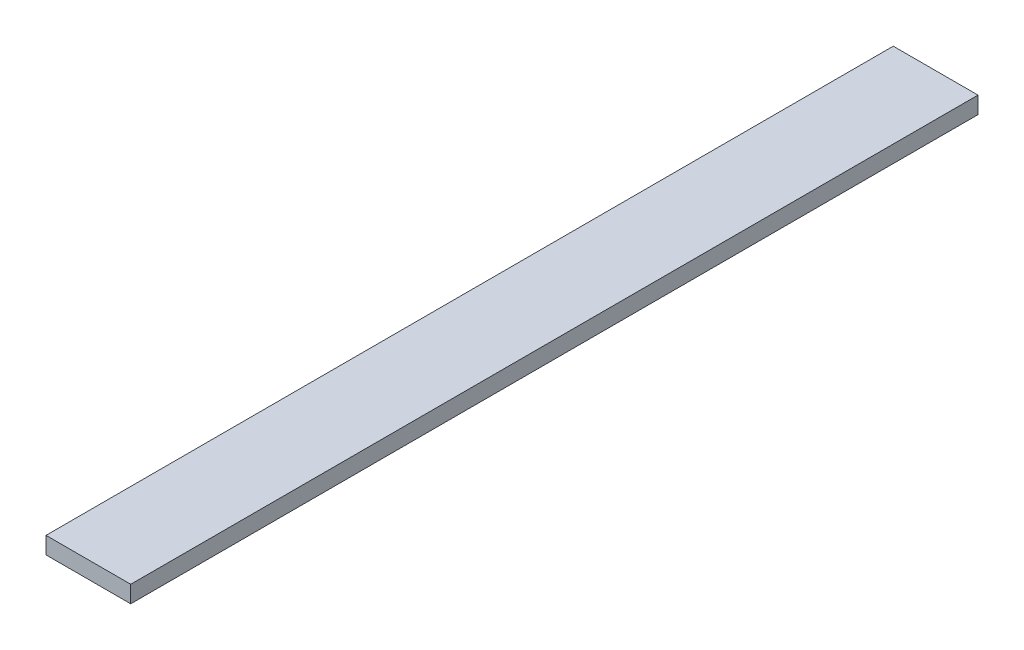
ISO-10303-21;
HEADER;
FILE_DESCRIPTION(('STEP AP214'),'2;1');
FILE_NAME('part.step','',(''),(''),'','','');
FILE_SCHEMA(('AUTOMOTIVE_DESIGN { 1 0 10303 214 1 1 1 1 }'));
ENDSEC;
DATA;
#1=APPLICATION_CONTEXT('core data for automotive mechanical design processes');
#2=APPLICATION_PROTOCOL_DEFINITION('international standard','automotive_design',2000,#1);
#3=PRODUCT_CONTEXT('',#1,'mechanical');
#4=PRODUCT('Part','Part','',(#3));
#5=PRODUCT_RELATED_PRODUCT_CATEGORY('part','',(#4));
#6=PRODUCT_DEFINITION_FORMATION('','',#4);
#7=PRODUCT_DEFINITION_CONTEXT('part definition',#1,'design');
#8=PRODUCT_DEFINITION('design','',#6,#7);
#9=PRODUCT_DEFINITION_SHAPE('','',#8);
#10=(LENGTH_UNIT() NAMED_UNIT(*) SI_UNIT(.MILLI.,.METRE.));
#11=(NAMED_UNIT(*) PLANE_ANGLE_UNIT() SI_UNIT($,.RADIAN.));
#12=(NAMED_UNIT(*) SI_UNIT($,.STERADIAN.) SOLID_ANGLE_UNIT());
#13=UNCERTAINTY_MEASURE_WITH_UNIT(LENGTH_MEASURE(1.E-05),#10,'distance_accuracy_value','');
#14=(GEOMETRIC_REPRESENTATION_CONTEXT(3) GLOBAL_UNCERTAINTY_ASSIGNED_CONTEXT((#13)) GLOBAL_UNIT_ASSIGNED_CONTEXT((#10,
#11,#12)) REPRESENTATION_CONTEXT('',''));
#15=CARTESIAN_POINT('',(0.,0.,0.));
#16=DIRECTION('',(0.,0.,1.));
#17=DIRECTION('',(1.,0.,0.));
#18=AXIS2_PLACEMENT_3D('',#15,#16,#17);
#19=CARTESIAN_POINT('',(0.,5.,0.));
#20=DIRECTION('',(1.,0.,0.));
#21=DIRECTION('',(0.,0.,-1.));
#22=AXIS2_PLACEMENT_3D('',#19,#20,#21);
#23=PLANE('',#22);
#24=DIRECTION('',(0.,0.,1.));
#25=VECTOR('',#24,1.);
#26=CARTESIAN_POINT('',(0.,0.,0.));
#27=LINE('',#26,#25);
#28=CARTESIAN_POINT('',(0.,0.,-250.));
#29=VERTEX_POINT('',#28);
#30=CARTESIAN_POINT('',(0.,0.,0.));
#31=VERTEX_POINT('',#30);
#32=EDGE_CURVE('E104',#29,#31,#27,.T.);
#33=ORIENTED_EDGE('',*,*,#32,.T.);
#34=DIRECTION('',(0.,-1.,0.));
#35=VECTOR('',#34,1.);
#36=CARTESIAN_POINT('',(0.,5.,0.));
#37=LINE('',#36,#35);
#38=CARTESIAN_POINT('',(0.,5.,0.));
#39=VERTEX_POINT('',#38);
#40=EDGE_CURVE('E11',#39,#31,#37,.T.);
#41=ORIENTED_EDGE('',*,*,#40,.F.);
#42=DIRECTION('',(0.,0.,1.));
#43=VECTOR('',#42,1.);
#44=CARTESIAN_POINT('',(0.,5.,0.));
#45=LINE('',#44,#43);
#46=CARTESIAN_POINT('',(0.,5.,-250.));
#47=VERTEX_POINT('',#46);
#48=EDGE_CURVE('E92',#47,#39,#45,.T.);
#49=ORIENTED_EDGE('',*,*,#48,.F.);
#50=DIRECTION('',(0.,-1.,0.));
#51=VECTOR('',#50,1.);
#52=CARTESIAN_POINT('',(0.,5.,-250.));
#53=LINE('',#52,#51);
#54=EDGE_CURVE('E100',#47,#29,#53,.T.);
#55=ORIENTED_EDGE('',*,*,#54,.T.);
#56=EDGE_LOOP('',(#33,#41,#49,#55));
#57=FACE_BOUND('',#56,.T.);
#58=ADVANCED_FACE('F41',(#57),#23,.F.);
#59=CARTESIAN_POINT('',(0.,5.,0.));
#60=DIRECTION('',(0.,0.,-1.));
#61=DIRECTION('',(-1.,0.,0.));
#62=AXIS2_PLACEMENT_3D('',#59,#60,#61);
#63=PLANE('',#62);
#64=DIRECTION('',(1.,0.,0.));
#65=VECTOR('',#64,1.);
#66=CARTESIAN_POINT('',(0.,0.,0.));
#67=LINE('',#66,#65);
#68=CARTESIAN_POINT('',(25.,0.,0.));
#69=VERTEX_POINT('',#68);
#70=EDGE_CURVE('E96',#31,#69,#67,.T.);
#71=ORIENTED_EDGE('',*,*,#70,.T.);
#72=DIRECTION('',(0.,-1.,0.));
#73=VECTOR('',#72,1.);
#74=CARTESIAN_POINT('',(25.,5.,0.));
#75=LINE('',#74,#73);
#76=CARTESIAN_POINT('',(25.,5.,0.));
#77=VERTEX_POINT('',#76);
#78=EDGE_CURVE('E49',#77,#69,#75,.T.);
#79=ORIENTED_EDGE('',*,*,#78,.F.);
#80=DIRECTION('',(1.,0.,0.));
#81=VECTOR('',#80,1.);
#82=CARTESIAN_POINT('',(0.,5.,0.));
#83=LINE('',#82,#81);
#84=EDGE_CURVE('E87',#39,#77,#83,.T.);
#85=ORIENTED_EDGE('',*,*,#84,.F.);
#86=ORIENTED_EDGE('',*,*,#40,.T.);
#87=EDGE_LOOP('',(#71,#79,#85,#86));
#88=FACE_BOUND('',#87,.T.);
#89=ADVANCED_FACE('F95',(#88),#63,.F.);
#90=CARTESIAN_POINT('',(25.,5.,0.));
#91=DIRECTION('',(-1.,0.,0.));
#92=DIRECTION('',(0.,0.,1.));
#93=AXIS2_PLACEMENT_3D('',#90,#91,#92);
#94=PLANE('',#93);
#95=DIRECTION('',(0.,0.,-1.));
#96=VECTOR('',#95,1.);
#97=CARTESIAN_POINT('',(25.,0.,0.));
#98=LINE('',#97,#96);
#99=CARTESIAN_POINT('',(25.,0.,-250.));
#100=VERTEX_POINT('',#99);
#101=EDGE_CURVE('E74',#69,#100,#98,.T.);
#102=ORIENTED_EDGE('',*,*,#101,.T.);
#103=DIRECTION('',(0.,-1.,0.));
#104=VECTOR('',#103,1.);
#105=CARTESIAN_POINT('',(25.,5.,-250.));
#106=LINE('',#105,#104);
#107=CARTESIAN_POINT('',(25.,5.,-250.));
#108=VERTEX_POINT('',#107);
#109=EDGE_CURVE('E97',#108,#100,#106,.T.);
#110=ORIENTED_EDGE('',*,*,#109,.F.);
#111=DIRECTION('',(0.,0.,-1.));
#112=VECTOR('',#111,1.);
#113=CARTESIAN_POINT('',(25.,5.,0.));
#114=LINE('',#113,#112);
#115=EDGE_CURVE('E90',#77,#108,#114,.T.);
#116=ORIENTED_EDGE('',*,*,#115,.F.);
#117=ORIENTED_EDGE('',*,*,#78,.T.);
#118=EDGE_LOOP('',(#102,#110,#116,#117));
#119=FACE_BOUND('',#118,.T.);
#120=ADVANCED_FACE('F98',(#119),#94,.F.);
#121=CARTESIAN_POINT('',(0.,5.,-250.));
#122=DIRECTION('',(0.,0.,1.));
#123=DIRECTION('',(1.,0.,0.));
#124=AXIS2_PLACEMENT_3D('',#121,#122,#123);
#125=PLANE('',#124);
#126=DIRECTION('',(-1.,0.,0.));
#127=VECTOR('',#126,1.);
#128=CARTESIAN_POINT('',(0.,0.,-250.));
#129=LINE('',#128,#127);
#130=EDGE_CURVE('E80',#100,#29,#129,.T.);
#131=ORIENTED_EDGE('',*,*,#130,.T.);
#132=ORIENTED_EDGE('',*,*,#54,.F.);
#133=DIRECTION('',(-1.,0.,0.));
#134=VECTOR('',#133,1.);
#135=CARTESIAN_POINT('',(0.,5.,-250.));
#136=LINE('',#135,#134);
#137=EDGE_CURVE('E57',#108,#47,#136,.T.);
#138=ORIENTED_EDGE('',*,*,#137,.F.);
#139=ORIENTED_EDGE('',*,*,#109,.T.);
#140=EDGE_LOOP('',(#131,#132,#138,#139));
#141=FACE_BOUND('',#140,.T.);
#142=ADVANCED_FACE('F111',(#141),#125,.F.);
#143=CARTESIAN_POINT('',(0.,5.,0.));
#144=DIRECTION('',(0.,-1.,0.));
#145=DIRECTION('',(0.,0.,-1.));
#146=AXIS2_PLACEMENT_3D('',#143,#144,#145);
#147=PLANE('',#146);
#148=ORIENTED_EDGE('',*,*,#48,.T.);
#149=ORIENTED_EDGE('',*,*,#84,.T.);
#150=ORIENTED_EDGE('',*,*,#115,.T.);
#151=ORIENTED_EDGE('',*,*,#137,.T.);
#152=EDGE_LOOP('',(#148,#149,#150,#151));
#153=FACE_BOUND('',#152,.T.);
#154=ADVANCED_FACE('F88',(#153),#147,.F.);
#155=CARTESIAN_POINT('',(0.,0.,0.));
#156=DIRECTION('',(0.,-1.,0.));
#157=DIRECTION('',(0.,0.,-1.));
#158=AXIS2_PLACEMENT_3D('',#155,#156,#157);
#159=PLANE('',#158);
#160=ORIENTED_EDGE('',*,*,#32,.F.);
#161=ORIENTED_EDGE('',*,*,#130,.F.);
#162=ORIENTED_EDGE('',*,*,#101,.F.);
#163=ORIENTED_EDGE('',*,*,#70,.F.);
#164=EDGE_LOOP('',(#160,#161,#162,#163));
#165=FACE_BOUND('',#164,.T.);
#166=ADVANCED_FACE('F114',(#165),#159,.T.);
#167=CLOSED_SHELL('',(#58,#89,#120,#142,#154,#166));
#168=MANIFOLD_SOLID_BREP('B2',#167);
#169=ADVANCED_BREP_SHAPE_REPRESENTATION('',(#18,#168),#14);
#170=SHAPE_DEFINITION_REPRESENTATION(#9,#169);
ENDSEC;
END-ISO-10303-21;
